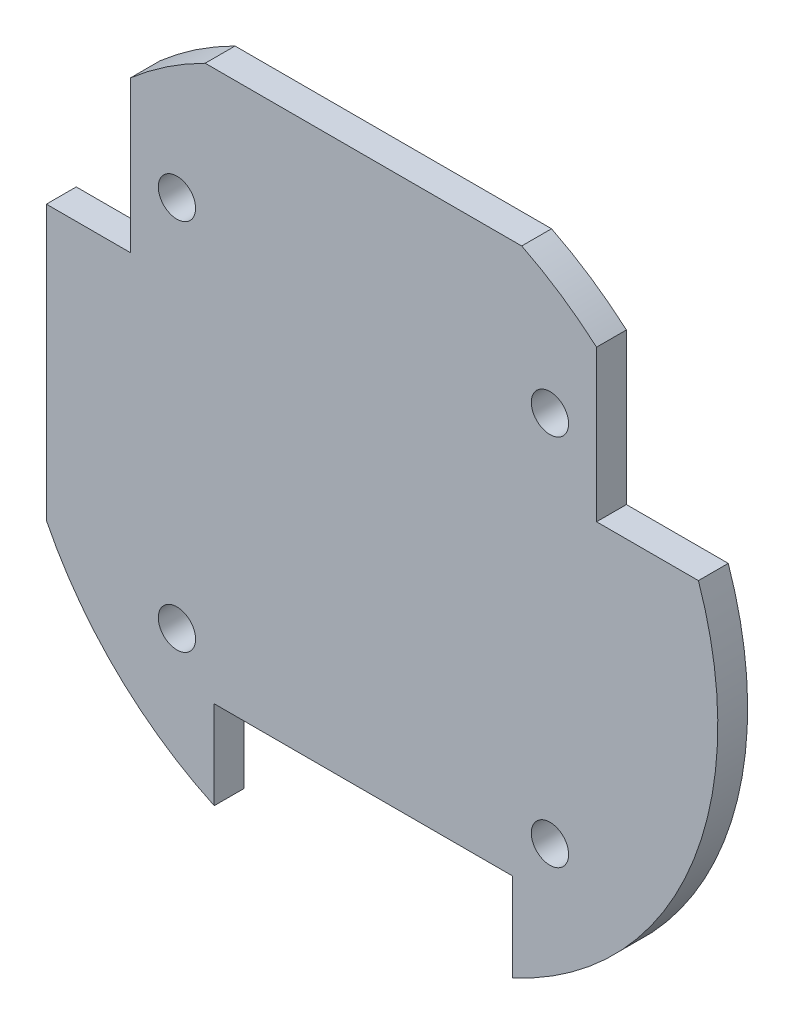
ISO-10303-21;
HEADER;
FILE_DESCRIPTION(('STEP AP214'),'2;1');
FILE_NAME('part.step','',(''),(''),'','','');
FILE_SCHEMA(('AUTOMOTIVE_DESIGN { 1 0 10303 214 1 1 1 1 }'));
ENDSEC;
DATA;
#1=APPLICATION_CONTEXT('core data for automotive mechanical design processes');
#2=APPLICATION_PROTOCOL_DEFINITION('international standard','automotive_design',2000,#1);
#3=PRODUCT_CONTEXT('',#1,'mechanical');
#4=PRODUCT('Part','Part','',(#3));
#5=PRODUCT_RELATED_PRODUCT_CATEGORY('part','',(#4));
#6=PRODUCT_DEFINITION_FORMATION('','',#4);
#7=PRODUCT_DEFINITION_CONTEXT('part definition',#1,'design');
#8=PRODUCT_DEFINITION('design','',#6,#7);
#9=PRODUCT_DEFINITION_SHAPE('','',#8);
#10=(LENGTH_UNIT() NAMED_UNIT(*) SI_UNIT(.MILLI.,.METRE.));
#11=(NAMED_UNIT(*) PLANE_ANGLE_UNIT() SI_UNIT($,.RADIAN.));
#12=(NAMED_UNIT(*) SI_UNIT($,.STERADIAN.) SOLID_ANGLE_UNIT());
#13=UNCERTAINTY_MEASURE_WITH_UNIT(LENGTH_MEASURE(1.E-05),#10,'distance_accuracy_value','');
#14=(GEOMETRIC_REPRESENTATION_CONTEXT(3) GLOBAL_UNCERTAINTY_ASSIGNED_CONTEXT((#13)) GLOBAL_UNIT_ASSIGNED_CONTEXT((#10,
#11,#12)) REPRESENTATION_CONTEXT('',''));
#15=CARTESIAN_POINT('',(0.,0.,0.));
#16=DIRECTION('',(0.,0.,1.));
#17=DIRECTION('',(1.,0.,0.));
#18=AXIS2_PLACEMENT_3D('',#15,#16,#17);
#19=CARTESIAN_POINT('',(0.,-13.25038901263,1.6));
#20=DIRECTION('',(0.,0.,-1.));
#21=DIRECTION('',(-1.,0.,0.));
#22=AXIS2_PLACEMENT_3D('',#19,#20,#21);
#23=CYLINDRICAL_SURFACE('',#22,19.);
#24=CARTESIAN_POINT('',(0.,-13.25038901263,1.6));
#25=DIRECTION('',(0.,0.,1.));
#26=DIRECTION('',(1.,0.,0.));
#27=AXIS2_PLACEMENT_3D('',#24,#25,#26);
#28=CIRCLE('',#27,19.);
#29=CARTESIAN_POINT('',(7.99999999999993,-30.4840769522444,1.59999999999975));
#30=VERTEX_POINT('',#29);
#31=CARTESIAN_POINT('',(17.9599554565149,-7.05038901263001,1.6));
#32=VERTEX_POINT('',#31);
#33=EDGE_CURVE('E200',#30,#32,#28,.T.);
#34=ORIENTED_EDGE('',*,*,#33,.F.);
#35=DIRECTION('',(0.,0.,-1.));
#36=VECTOR('',#35,1.);
#37=CARTESIAN_POINT('',(7.99999999999993,-30.4840769522444,1.59999999999975));
#38=LINE('',#37,#36);
#39=CARTESIAN_POINT('',(7.99999999999993,-30.4840769522442,0.));
#40=VERTEX_POINT('',#39);
#41=EDGE_CURVE('E313',#30,#40,#38,.T.);
#42=ORIENTED_EDGE('',*,*,#41,.T.);
#43=CARTESIAN_POINT('',(0.,-13.25038901263,0.));
#44=DIRECTION('',(0.,0.,1.));
#45=DIRECTION('',(1.,0.,0.));
#46=AXIS2_PLACEMENT_3D('',#43,#44,#45);
#47=CIRCLE('',#46,19.);
#48=CARTESIAN_POINT('',(17.9599554565149,-7.05038901263002,0.));
#49=VERTEX_POINT('',#48);
#50=EDGE_CURVE('E169',#40,#49,#47,.T.);
#51=ORIENTED_EDGE('',*,*,#50,.T.);
#52=DIRECTION('',(0.,0.,-1.));
#53=VECTOR('',#52,1.);
#54=CARTESIAN_POINT('',(17.9599554565149,-7.05038901263001,1.6));
#55=LINE('',#54,#53);
#56=EDGE_CURVE('E47',#32,#49,#55,.T.);
#57=ORIENTED_EDGE('',*,*,#56,.F.);
#58=EDGE_LOOP('',(#34,#42,#51,#57));
#59=FACE_BOUND('',#58,.T.);
#60=ADVANCED_FACE('F44',(#59),#23,.T.);
#61=CARTESIAN_POINT('',(-17.,-21.7356703868686,0.));
#62=VERTEX_POINT('',#61);
#63=CARTESIAN_POINT('',(-8.00000000000007,-30.4840769522441,0.));
#64=VERTEX_POINT('',#63);
#65=EDGE_CURVE('E171',#62,#64,#47,.T.);
#66=ORIENTED_EDGE('',*,*,#65,.T.);
#67=DIRECTION('',(0.,0.,-1.));
#68=VECTOR('',#67,1.);
#69=CARTESIAN_POINT('',(-8.00000000000007,-30.4840769522441,1.59999999999994));
#70=LINE('',#69,#68);
#71=CARTESIAN_POINT('',(-8.00000000000007,-30.4840769522441,1.59999999999994));
#72=VERTEX_POINT('',#71);
#73=EDGE_CURVE('E312',#64,#72,#70,.F.);
#74=ORIENTED_EDGE('',*,*,#73,.T.);
#75=CARTESIAN_POINT('',(-17.,-21.7356703868687,1.59999999999988));
#76=VERTEX_POINT('',#75);
#77=EDGE_CURVE('E182',#76,#72,#28,.T.);
#78=ORIENTED_EDGE('',*,*,#77,.F.);
#79=DIRECTION('',(0.,0.,1.));
#80=VECTOR('',#79,1.);
#81=CARTESIAN_POINT('',(-17.,-21.7356703868686,0.));
#82=LINE('',#81,#80);
#83=EDGE_CURVE('E234',#62,#76,#82,.T.);
#84=ORIENTED_EDGE('',*,*,#83,.F.);
#85=EDGE_LOOP('',(#66,#74,#78,#84));
#86=FACE_BOUND('',#85,.T.);
#87=ADVANCED_FACE('F50',(#86),#23,.T.);
#88=DIRECTION('',(0.,0.,-1.));
#89=VECTOR('',#88,1.);
#90=CARTESIAN_POINT('',(12.4999999999999,1.05869900862419,1.6));
#91=LINE('',#90,#89);
#92=CARTESIAN_POINT('',(12.4999999999999,1.05869900862419,1.6));
#93=VERTEX_POINT('',#92);
#94=CARTESIAN_POINT('',(12.4999999999999,1.05869900862418,0.));
#95=VERTEX_POINT('',#94);
#96=EDGE_CURVE('E227',#93,#95,#91,.T.);
#97=ORIENTED_EDGE('',*,*,#96,.T.);
#98=CARTESIAN_POINT('',(8.48528137423857,3.74961098737,0.));
#99=VERTEX_POINT('',#98);
#100=EDGE_CURVE('E172',#95,#99,#47,.T.);
#101=ORIENTED_EDGE('',*,*,#100,.T.);
#102=DIRECTION('',(0.,0.,1.));
#103=VECTOR('',#102,1.);
#104=CARTESIAN_POINT('',(8.48528137423857,3.74961098737,0.));
#105=LINE('',#104,#103);
#106=CARTESIAN_POINT('',(8.48528137423857,3.74961098737,1.6));
#107=VERTEX_POINT('',#106);
#108=EDGE_CURVE('E243',#99,#107,#105,.T.);
#109=ORIENTED_EDGE('',*,*,#108,.T.);
#110=EDGE_CURVE('E195',#93,#107,#28,.T.);
#111=ORIENTED_EDGE('',*,*,#110,.F.);
#112=EDGE_LOOP('',(#97,#101,#109,#111));
#113=FACE_BOUND('',#112,.T.);
#114=ADVANCED_FACE('F291',(#113),#23,.T.);
#115=CARTESIAN_POINT('',(0.,-13.25038901263,1.6));
#116=DIRECTION('',(0.,0.,1.));
#117=DIRECTION('',(1.,0.,0.));
#118=AXIS2_PLACEMENT_3D('',#115,#116,#117);
#119=PLANE('',#118);
#120=DIRECTION('',(0.,1.,0.));
#121=VECTOR('',#120,1.);
#122=CARTESIAN_POINT('',(7.99999999999993,-36.8182264519574,1.6));
#123=LINE('',#122,#121);
#124=CARTESIAN_POINT('',(7.99999999999985,-25.7503890126301,1.59999999999989));
#125=VERTEX_POINT('',#124);
#126=EDGE_CURVE('E155',#30,#125,#123,.T.);
#127=ORIENTED_EDGE('',*,*,#126,.F.);
#128=ORIENTED_EDGE('',*,*,#33,.T.);
#129=DIRECTION('',(1.,0.,0.));
#130=VECTOR('',#129,1.);
#131=CARTESIAN_POINT('',(12.5,-7.05038901263001,1.6));
#132=LINE('',#131,#130);
#133=CARTESIAN_POINT('',(12.5,-7.05038901263001,1.6));
#134=VERTEX_POINT('',#133);
#135=EDGE_CURVE('E311',#134,#32,#132,.T.);
#136=ORIENTED_EDGE('',*,*,#135,.F.);
#137=DIRECTION('',(0.,-1.,0.));
#138=VECTOR('',#137,1.);
#139=CARTESIAN_POINT('',(12.4999999999999,-5.15038901263001,1.6));
#140=LINE('',#139,#138);
#141=EDGE_CURVE('E318',#93,#134,#140,.T.);
#142=ORIENTED_EDGE('',*,*,#141,.F.);
#143=ORIENTED_EDGE('',*,*,#110,.T.);
#144=DIRECTION('',(1.,0.,0.));
#145=VECTOR('',#144,1.);
#146=CARTESIAN_POINT('',(-8.48528137423857,3.74961098736998,1.6));
#147=LINE('',#146,#145);
#148=CARTESIAN_POINT('',(-8.48528137423857,3.74961098736998,1.6));
#149=VERTEX_POINT('',#148);
#150=EDGE_CURVE('E236',#149,#107,#147,.T.);
#151=ORIENTED_EDGE('',*,*,#150,.F.);
#152=CARTESIAN_POINT('',(-12.5000000000001,1.0586990086242,1.6));
#153=VERTEX_POINT('',#152);
#154=EDGE_CURVE('E188',#149,#153,#28,.T.);
#155=ORIENTED_EDGE('',*,*,#154,.T.);
#156=DIRECTION('',(0.,-1.,0.));
#157=VECTOR('',#156,1.);
#158=CARTESIAN_POINT('',(-12.5000000000001,-5.15038901263002,1.6));
#159=LINE('',#158,#157);
#160=CARTESIAN_POINT('',(-12.5,-7.05038901263002,1.6));
#161=VERTEX_POINT('',#160);
#162=EDGE_CURVE('E230',#153,#161,#159,.T.);
#163=ORIENTED_EDGE('',*,*,#162,.T.);
#164=DIRECTION('',(-1.,0.,0.));
#165=VECTOR('',#164,1.);
#166=CARTESIAN_POINT('',(-12.5,-7.05038901263002,1.6));
#167=LINE('',#166,#165);
#168=CARTESIAN_POINT('',(-17.,-7.05038901263001,1.6));
#169=VERTEX_POINT('',#168);
#170=EDGE_CURVE('E222',#161,#169,#167,.T.);
#171=ORIENTED_EDGE('',*,*,#170,.T.);
#172=DIRECTION('',(0.,1.,0.));
#173=VECTOR('',#172,1.);
#174=CARTESIAN_POINT('',(-17.,-4.76510763839143,1.6));
#175=LINE('',#174,#173);
#176=EDGE_CURVE('E238',#76,#169,#175,.T.);
#177=ORIENTED_EDGE('',*,*,#176,.F.);
#178=ORIENTED_EDGE('',*,*,#77,.T.);
#179=DIRECTION('',(0.,-1.,0.));
#180=VECTOR('',#179,1.);
#181=CARTESIAN_POINT('',(-8.00000000000007,-36.8182264519574,1.6));
#182=LINE('',#181,#180);
#183=CARTESIAN_POINT('',(-8.00000000000015,-25.75038901263,1.59999999999994));
#184=VERTEX_POINT('',#183);
#185=EDGE_CURVE('E165',#184,#72,#182,.T.);
#186=ORIENTED_EDGE('',*,*,#185,.F.);
#187=DIRECTION('',(-1.,0.,0.));
#188=VECTOR('',#187,1.);
#189=CARTESIAN_POINT('',(-8.00000000000015,-25.75038901263,1.59999999999994));
#190=LINE('',#189,#188);
#191=EDGE_CURVE('E466',#125,#184,#190,.T.);
#192=ORIENTED_EDGE('',*,*,#191,.F.);
#193=EDGE_LOOP('',(#127,#128,#136,#142,#143,#151,#155,#163,#171,#177,#178,#186,#192));
#194=FACE_BOUND('',#193,.T.);
#195=CARTESIAN_POINT('',(9.99999999999985,-23.25038901263,1.6));
#196=DIRECTION('',(0.,0.,1.));
#197=DIRECTION('',(1.,0.,0.));
#198=AXIS2_PLACEMENT_3D('',#195,#196,#197);
#199=CIRCLE('',#198,1.00000000000001);
#200=CARTESIAN_POINT('',(10.9999999999999,-23.25038901263,1.6));
#201=VERTEX_POINT('',#200);
#202=EDGE_CURVE('E261',#201,#201,#199,.T.);
#203=ORIENTED_EDGE('',*,*,#202,.F.);
#204=EDGE_LOOP('',(#203));
#205=FACE_BOUND('',#204,.T.);
#206=CARTESIAN_POINT('',(-10.0000000000001,-3.25038901263,1.6));
#207=DIRECTION('',(0.,0.,1.));
#208=DIRECTION('',(1.,0.,0.));
#209=AXIS2_PLACEMENT_3D('',#206,#207,#208);
#210=CIRCLE('',#209,1.00000000000002);
#211=CARTESIAN_POINT('',(-9.00000000000006,-3.25038901263,1.6));
#212=VERTEX_POINT('',#211);
#213=EDGE_CURVE('E177',#212,#212,#210,.T.);
#214=ORIENTED_EDGE('',*,*,#213,.F.);
#215=EDGE_LOOP('',(#214));
#216=FACE_BOUND('',#215,.T.);
#217=CARTESIAN_POINT('',(9.99999999999992,-3.25038901263,1.6));
#218=DIRECTION('',(0.,0.,1.));
#219=DIRECTION('',(1.,0.,0.));
#220=AXIS2_PLACEMENT_3D('',#217,#218,#219);
#221=CIRCLE('',#220,0.999999999999998);
#222=CARTESIAN_POINT('',(10.9999999999999,-3.25038901263,1.6));
#223=VERTEX_POINT('',#222);
#224=EDGE_CURVE('E270',#223,#223,#221,.T.);
#225=ORIENTED_EDGE('',*,*,#224,.F.);
#226=EDGE_LOOP('',(#225));
#227=FACE_BOUND('',#226,.T.);
#228=CARTESIAN_POINT('',(-10.0000000000002,-23.2503890126301,1.59999999999997));
#229=DIRECTION('',(0.,0.,1.));
#230=DIRECTION('',(1.,0.,0.));
#231=AXIS2_PLACEMENT_3D('',#228,#229,#230);
#232=CIRCLE('',#231,1.00000000000001);
#233=CARTESIAN_POINT('',(-9.00000000000015,-23.25038901263,1.59999999999997));
#234=VERTEX_POINT('',#233);
#235=EDGE_CURVE('E251',#234,#234,#232,.T.);
#236=ORIENTED_EDGE('',*,*,#235,.F.);
#237=EDGE_LOOP('',(#236));
#238=FACE_BOUND('',#237,.T.);
#239=ADVANCED_FACE('F305',(#194,#205,#216,#227,#238),#119,.T.);
#240=CARTESIAN_POINT('',(0.,-13.25038901263,0.));
#241=DIRECTION('',(0.,0.,1.));
#242=DIRECTION('',(1.,0.,0.));
#243=AXIS2_PLACEMENT_3D('',#240,#241,#242);
#244=PLANE('',#243);
#245=ORIENTED_EDGE('',*,*,#50,.F.);
#246=DIRECTION('',(0.,1.,0.));
#247=VECTOR('',#246,1.);
#248=CARTESIAN_POINT('',(7.99999999999993,-36.8182264519575,0.));
#249=LINE('',#248,#247);
#250=CARTESIAN_POINT('',(7.99999999999985,-25.75038901263,0.));
#251=VERTEX_POINT('',#250);
#252=EDGE_CURVE('E11',#40,#251,#249,.T.);
#253=ORIENTED_EDGE('',*,*,#252,.T.);
#254=DIRECTION('',(-1.,0.,0.));
#255=VECTOR('',#254,1.);
#256=CARTESIAN_POINT('',(-8.00000000000015,-25.75038901263,0.));
#257=LINE('',#256,#255);
#258=CARTESIAN_POINT('',(-8.00000000000015,-25.75038901263,0.));
#259=VERTEX_POINT('',#258);
#260=EDGE_CURVE('E157',#251,#259,#257,.T.);
#261=ORIENTED_EDGE('',*,*,#260,.T.);
#262=DIRECTION('',(0.,-1.,0.));
#263=VECTOR('',#262,1.);
#264=CARTESIAN_POINT('',(-8.00000000000007,-36.8182264519574,0.));
#265=LINE('',#264,#263);
#266=EDGE_CURVE('E63',#259,#64,#265,.T.);
#267=ORIENTED_EDGE('',*,*,#266,.T.);
#268=ORIENTED_EDGE('',*,*,#65,.F.);
#269=DIRECTION('',(0.,1.,0.));
#270=VECTOR('',#269,1.);
#271=CARTESIAN_POINT('',(-17.,-4.76510763839144,0.));
#272=LINE('',#271,#270);
#273=CARTESIAN_POINT('',(-17.,-7.05038901263002,0.));
#274=VERTEX_POINT('',#273);
#275=EDGE_CURVE('E246',#62,#274,#272,.T.);
#276=ORIENTED_EDGE('',*,*,#275,.T.);
#277=DIRECTION('',(-1.,0.,0.));
#278=VECTOR('',#277,1.);
#279=CARTESIAN_POINT('',(-17.,-7.05038901263002,0.));
#280=LINE('',#279,#278);
#281=CARTESIAN_POINT('',(-12.5,-7.05038901263003,0.));
#282=VERTEX_POINT('',#281);
#283=EDGE_CURVE('E217',#282,#274,#280,.T.);
#284=ORIENTED_EDGE('',*,*,#283,.F.);
#285=DIRECTION('',(0.,-1.,0.));
#286=VECTOR('',#285,1.);
#287=CARTESIAN_POINT('',(-12.5000000000001,-5.15038901263003,0.));
#288=LINE('',#287,#286);
#289=CARTESIAN_POINT('',(-12.5000000000001,1.05869900862419,0.));
#290=VERTEX_POINT('',#289);
#291=EDGE_CURVE('E220',#290,#282,#288,.T.);
#292=ORIENTED_EDGE('',*,*,#291,.F.);
#293=CARTESIAN_POINT('',(-8.48528137423857,3.74961098736999,0.));
#294=VERTEX_POINT('',#293);
#295=EDGE_CURVE('E176',#294,#290,#47,.T.);
#296=ORIENTED_EDGE('',*,*,#295,.F.);
#297=DIRECTION('',(1.,0.,0.));
#298=VECTOR('',#297,1.);
#299=CARTESIAN_POINT('',(-8.48528137423857,3.74961098736999,0.));
#300=LINE('',#299,#298);
#301=EDGE_CURVE('E212',#294,#99,#300,.T.);
#302=ORIENTED_EDGE('',*,*,#301,.T.);
#303=ORIENTED_EDGE('',*,*,#100,.F.);
#304=DIRECTION('',(0.,-1.,0.));
#305=VECTOR('',#304,1.);
#306=CARTESIAN_POINT('',(12.4999999999999,-5.15038901263001,0.));
#307=LINE('',#306,#305);
#308=CARTESIAN_POINT('',(12.5,-7.05038901263001,0.));
#309=VERTEX_POINT('',#308);
#310=EDGE_CURVE('E67',#95,#309,#307,.T.);
#311=ORIENTED_EDGE('',*,*,#310,.T.);
#312=DIRECTION('',(1.,0.,0.));
#313=VECTOR('',#312,1.);
#314=CARTESIAN_POINT('',(17.,-7.05038901263002,0.));
#315=LINE('',#314,#313);
#316=EDGE_CURVE('E166',#309,#49,#315,.T.);
#317=ORIENTED_EDGE('',*,*,#316,.T.);
#318=EDGE_LOOP('',(#245,#253,#261,#267,#268,#276,#284,#292,#296,#302,#303,#311,#317));
#319=FACE_BOUND('',#318,.T.);
#320=CARTESIAN_POINT('',(-10.0000000000002,-23.25038901263,0.));
#321=DIRECTION('',(0.,0.,1.));
#322=DIRECTION('',(1.,0.,0.));
#323=AXIS2_PLACEMENT_3D('',#320,#321,#322);
#324=CIRCLE('',#323,1.00000000000001);
#325=CARTESIAN_POINT('',(-9.00000000000015,-23.25038901263,0.));
#326=VERTEX_POINT('',#325);
#327=EDGE_CURVE('E242',#326,#326,#324,.T.);
#328=ORIENTED_EDGE('',*,*,#327,.T.);
#329=EDGE_LOOP('',(#328));
#330=FACE_BOUND('',#329,.T.);
#331=CARTESIAN_POINT('',(9.99999999999985,-23.25038901263,0.));
#332=DIRECTION('',(0.,0.,1.));
#333=DIRECTION('',(1.,0.,0.));
#334=AXIS2_PLACEMENT_3D('',#331,#332,#333);
#335=CIRCLE('',#334,1.00000000000001);
#336=CARTESIAN_POINT('',(10.9999999999999,-23.25038901263,0.));
#337=VERTEX_POINT('',#336);
#338=EDGE_CURVE('E260',#337,#337,#335,.T.);
#339=ORIENTED_EDGE('',*,*,#338,.T.);
#340=EDGE_LOOP('',(#339));
#341=FACE_BOUND('',#340,.T.);
#342=CARTESIAN_POINT('',(9.99999999999992,-3.25038901263,0.));
#343=DIRECTION('',(0.,0.,1.));
#344=DIRECTION('',(1.,0.,0.));
#345=AXIS2_PLACEMENT_3D('',#342,#343,#344);
#346=CIRCLE('',#345,0.999999999999998);
#347=CARTESIAN_POINT('',(10.9999999999999,-3.25038901263,0.));
#348=VERTEX_POINT('',#347);
#349=EDGE_CURVE('E262',#348,#348,#346,.T.);
#350=ORIENTED_EDGE('',*,*,#349,.T.);
#351=EDGE_LOOP('',(#350));
#352=FACE_BOUND('',#351,.T.);
#353=CARTESIAN_POINT('',(-10.0000000000001,-3.25038901263,0.));
#354=DIRECTION('',(0.,0.,1.));
#355=DIRECTION('',(1.,0.,0.));
#356=AXIS2_PLACEMENT_3D('',#353,#354,#355);
#357=CIRCLE('',#356,1.00000000000002);
#358=CARTESIAN_POINT('',(-9.00000000000006,-3.25038901263,0.));
#359=VERTEX_POINT('',#358);
#360=EDGE_CURVE('E271',#359,#359,#357,.T.);
#361=ORIENTED_EDGE('',*,*,#360,.T.);
#362=EDGE_LOOP('',(#361));
#363=FACE_BOUND('',#362,.T.);
#364=ADVANCED_FACE('F164',(#319,#330,#341,#352,#363),#244,.F.);
#365=ORIENTED_EDGE('',*,*,#295,.T.);
#366=DIRECTION('',(0.,0.,-1.));
#367=VECTOR('',#366,1.);
#368=CARTESIAN_POINT('',(-12.5000000000001,1.0586990086242,1.6));
#369=LINE('',#368,#367);
#370=EDGE_CURVE('E207',#153,#290,#369,.T.);
#371=ORIENTED_EDGE('',*,*,#370,.F.);
#372=ORIENTED_EDGE('',*,*,#154,.F.);
#373=DIRECTION('',(0.,0.,1.));
#374=VECTOR('',#373,1.);
#375=CARTESIAN_POINT('',(-8.48528137423857,3.74961098736999,0.));
#376=LINE('',#375,#374);
#377=EDGE_CURVE('E209',#294,#149,#376,.T.);
#378=ORIENTED_EDGE('',*,*,#377,.F.);
#379=EDGE_LOOP('',(#365,#371,#372,#378));
#380=FACE_BOUND('',#379,.T.);
#381=ADVANCED_FACE('F208',(#380),#23,.T.);
#382=CARTESIAN_POINT('',(-10.0000000000001,-3.25038901263,1.6));
#383=DIRECTION('',(0.,0.,-1.));
#384=DIRECTION('',(-1.,0.,0.));
#385=AXIS2_PLACEMENT_3D('',#382,#383,#384);
#386=CYLINDRICAL_SURFACE('',#385,1.00000000000002);
#387=ORIENTED_EDGE('',*,*,#213,.T.);
#388=EDGE_LOOP('',(#387));
#389=FACE_BOUND('',#388,.T.);
#390=ORIENTED_EDGE('',*,*,#360,.F.);
#391=EDGE_LOOP('',(#390));
#392=FACE_BOUND('',#391,.T.);
#393=ADVANCED_FACE('F283',(#389,#392),#386,.F.);
#394=CARTESIAN_POINT('',(9.99999999999992,-3.25038901263,1.6));
#395=DIRECTION('',(0.,0.,-1.));
#396=DIRECTION('',(-1.,0.,0.));
#397=AXIS2_PLACEMENT_3D('',#394,#395,#396);
#398=CYLINDRICAL_SURFACE('',#397,0.999999999999998);
#399=ORIENTED_EDGE('',*,*,#224,.T.);
#400=EDGE_LOOP('',(#399));
#401=FACE_BOUND('',#400,.T.);
#402=ORIENTED_EDGE('',*,*,#349,.F.);
#403=EDGE_LOOP('',(#402));
#404=FACE_BOUND('',#403,.T.);
#405=ADVANCED_FACE('F281',(#401,#404),#398,.F.);
#406=CARTESIAN_POINT('',(9.99999999999985,-23.25038901263,1.6));
#407=DIRECTION('',(0.,0.,-1.));
#408=DIRECTION('',(-1.,0.,0.));
#409=AXIS2_PLACEMENT_3D('',#406,#407,#408);
#410=CYLINDRICAL_SURFACE('',#409,1.00000000000001);
#411=ORIENTED_EDGE('',*,*,#202,.T.);
#412=EDGE_LOOP('',(#411));
#413=FACE_BOUND('',#412,.T.);
#414=ORIENTED_EDGE('',*,*,#338,.F.);
#415=EDGE_LOOP('',(#414));
#416=FACE_BOUND('',#415,.T.);
#417=ADVANCED_FACE('F289',(#413,#416),#410,.F.);
#418=CARTESIAN_POINT('',(-10.0000000000002,-23.2503890126301,1.59999999999997));
#419=DIRECTION('',(0.,0.,-1.));
#420=DIRECTION('',(-1.,0.,0.));
#421=AXIS2_PLACEMENT_3D('',#418,#419,#420);
#422=CYLINDRICAL_SURFACE('',#421,1.00000000000001);
#423=ORIENTED_EDGE('',*,*,#235,.T.);
#424=EDGE_LOOP('',(#423));
#425=FACE_BOUND('',#424,.T.);
#426=ORIENTED_EDGE('',*,*,#327,.F.);
#427=EDGE_LOOP('',(#426));
#428=FACE_BOUND('',#427,.T.);
#429=ADVANCED_FACE('F342',(#425,#428),#422,.F.);
#430=CARTESIAN_POINT('',(-17.,-4.76510763839144,0.));
#431=DIRECTION('',(1.,0.,0.));
#432=DIRECTION('',(0.,1.,0.));
#433=AXIS2_PLACEMENT_3D('',#430,#431,#432);
#434=PLANE('',#433);
#435=ORIENTED_EDGE('',*,*,#176,.T.);
#436=DIRECTION('',(0.,0.,-1.));
#437=VECTOR('',#436,1.);
#438=CARTESIAN_POINT('',(-17.,-7.05038901263002,0.));
#439=LINE('',#438,#437);
#440=EDGE_CURVE('E181',#169,#274,#439,.T.);
#441=ORIENTED_EDGE('',*,*,#440,.T.);
#442=ORIENTED_EDGE('',*,*,#275,.F.);
#443=ORIENTED_EDGE('',*,*,#83,.T.);
#444=EDGE_LOOP('',(#435,#441,#442,#443));
#445=FACE_BOUND('',#444,.T.);
#446=ADVANCED_FACE('F340',(#445),#434,.F.);
#447=CARTESIAN_POINT('',(-8.48528137423857,3.74961098736999,0.));
#448=DIRECTION('',(0.,-1.,0.));
#449=DIRECTION('',(0.,0.,-1.));
#450=AXIS2_PLACEMENT_3D('',#447,#448,#449);
#451=PLANE('',#450);
#452=ORIENTED_EDGE('',*,*,#150,.T.);
#453=ORIENTED_EDGE('',*,*,#108,.F.);
#454=ORIENTED_EDGE('',*,*,#301,.F.);
#455=ORIENTED_EDGE('',*,*,#377,.T.);
#456=EDGE_LOOP('',(#452,#453,#454,#455));
#457=FACE_BOUND('',#456,.T.);
#458=ADVANCED_FACE('F328',(#457),#451,.F.);
#459=CARTESIAN_POINT('',(-17.,-7.05038901263001,1.6));
#460=DIRECTION('',(0.,-1.,0.));
#461=DIRECTION('',(0.,0.,-1.));
#462=AXIS2_PLACEMENT_3D('',#459,#460,#461);
#463=PLANE('',#462);
#464=ORIENTED_EDGE('',*,*,#170,.F.);
#465=DIRECTION('',(0.,0.,-1.));
#466=VECTOR('',#465,1.);
#467=CARTESIAN_POINT('',(-12.5,-7.05038901263002,1.6));
#468=LINE('',#467,#466);
#469=EDGE_CURVE('E231',#161,#282,#468,.T.);
#470=ORIENTED_EDGE('',*,*,#469,.T.);
#471=ORIENTED_EDGE('',*,*,#283,.T.);
#472=ORIENTED_EDGE('',*,*,#440,.F.);
#473=EDGE_LOOP('',(#464,#470,#471,#472));
#474=FACE_BOUND('',#473,.T.);
#475=ADVANCED_FACE('F330',(#474),#463,.F.);
#476=CARTESIAN_POINT('',(-12.5000000000001,-5.15038901263002,1.6));
#477=DIRECTION('',(1.,0.,0.));
#478=DIRECTION('',(0.,0.,-1.));
#479=AXIS2_PLACEMENT_3D('',#476,#477,#478);
#480=PLANE('',#479);
#481=ORIENTED_EDGE('',*,*,#291,.T.);
#482=ORIENTED_EDGE('',*,*,#469,.F.);
#483=ORIENTED_EDGE('',*,*,#162,.F.);
#484=ORIENTED_EDGE('',*,*,#370,.T.);
#485=EDGE_LOOP('',(#481,#482,#483,#484));
#486=FACE_BOUND('',#485,.T.);
#487=ADVANCED_FACE('F324',(#486),#480,.F.);
#488=CARTESIAN_POINT('',(17.,-7.05038901263001,1.6));
#489=DIRECTION('',(0.,1.,0.));
#490=DIRECTION('',(0.,0.,1.));
#491=AXIS2_PLACEMENT_3D('',#488,#489,#490);
#492=PLANE('',#491);
#493=ORIENTED_EDGE('',*,*,#56,.T.);
#494=ORIENTED_EDGE('',*,*,#316,.F.);
#495=DIRECTION('',(0.,0.,-1.));
#496=VECTOR('',#495,1.);
#497=CARTESIAN_POINT('',(12.5,-7.05038901263001,1.6));
#498=LINE('',#497,#496);
#499=EDGE_CURVE('E310',#134,#309,#498,.T.);
#500=ORIENTED_EDGE('',*,*,#499,.F.);
#501=ORIENTED_EDGE('',*,*,#135,.T.);
#502=EDGE_LOOP('',(#493,#494,#500,#501));
#503=FACE_BOUND('',#502,.T.);
#504=ADVANCED_FACE('F333',(#503),#492,.T.);
#505=CARTESIAN_POINT('',(12.4999999999999,-5.15038901263001,1.6));
#506=DIRECTION('',(1.,0.,0.));
#507=DIRECTION('',(0.,0.,-1.));
#508=AXIS2_PLACEMENT_3D('',#505,#506,#507);
#509=PLANE('',#508);
#510=ORIENTED_EDGE('',*,*,#310,.F.);
#511=ORIENTED_EDGE('',*,*,#96,.F.);
#512=ORIENTED_EDGE('',*,*,#141,.T.);
#513=ORIENTED_EDGE('',*,*,#499,.T.);
#514=EDGE_LOOP('',(#510,#511,#512,#513));
#515=FACE_BOUND('',#514,.T.);
#516=ADVANCED_FACE('F416',(#515),#509,.T.);
#517=CARTESIAN_POINT('',(7.99999999999993,-36.8182264519575,0.));
#518=DIRECTION('',(1.,0.,0.));
#519=DIRECTION('',(0.,0.,-1.));
#520=AXIS2_PLACEMENT_3D('',#517,#518,#519);
#521=PLANE('',#520);
#522=ORIENTED_EDGE('',*,*,#126,.T.);
#523=DIRECTION('',(0.,0.,1.));
#524=VECTOR('',#523,1.);
#525=CARTESIAN_POINT('',(7.99999999999985,-25.75038901263,0.));
#526=LINE('',#525,#524);
#527=EDGE_CURVE('E150',#251,#125,#526,.T.);
#528=ORIENTED_EDGE('',*,*,#527,.F.);
#529=ORIENTED_EDGE('',*,*,#252,.F.);
#530=ORIENTED_EDGE('',*,*,#41,.F.);
#531=EDGE_LOOP('',(#522,#528,#529,#530));
#532=FACE_BOUND('',#531,.T.);
#533=ADVANCED_FACE('F149',(#532),#521,.F.);
#534=CARTESIAN_POINT('',(-8.00000000000007,-36.8182264519574,0.));
#535=DIRECTION('',(-1.,0.,0.));
#536=DIRECTION('',(0.,0.,1.));
#537=AXIS2_PLACEMENT_3D('',#534,#535,#536);
#538=PLANE('',#537);
#539=ORIENTED_EDGE('',*,*,#266,.F.);
#540=DIRECTION('',(0.,0.,1.));
#541=VECTOR('',#540,1.);
#542=CARTESIAN_POINT('',(-8.00000000000015,-25.75038901263,0.));
#543=LINE('',#542,#541);
#544=EDGE_CURVE('E156',#259,#184,#543,.T.);
#545=ORIENTED_EDGE('',*,*,#544,.T.);
#546=ORIENTED_EDGE('',*,*,#185,.T.);
#547=ORIENTED_EDGE('',*,*,#73,.F.);
#548=EDGE_LOOP('',(#539,#545,#546,#547));
#549=FACE_BOUND('',#548,.T.);
#550=ADVANCED_FACE('F443',(#549),#538,.F.);
#551=CARTESIAN_POINT('',(-8.00000000000015,-25.75038901263,0.));
#552=DIRECTION('',(0.,1.,0.));
#553=DIRECTION('',(0.,0.,1.));
#554=AXIS2_PLACEMENT_3D('',#551,#552,#553);
#555=PLANE('',#554);
#556=ORIENTED_EDGE('',*,*,#191,.T.);
#557=ORIENTED_EDGE('',*,*,#544,.F.);
#558=ORIENTED_EDGE('',*,*,#260,.F.);
#559=ORIENTED_EDGE('',*,*,#527,.T.);
#560=EDGE_LOOP('',(#556,#557,#558,#559));
#561=FACE_BOUND('',#560,.T.);
#562=ADVANCED_FACE('F159',(#561),#555,.F.);
#563=CLOSED_SHELL('',(#60,#87,#114,#239,#364,#381,#393,#405,#417,#429,#446,#458,#475,#487,#504,
#516,#533,#550,#562));
#564=MANIFOLD_SOLID_BREP('B2',#563);
#565=ADVANCED_BREP_SHAPE_REPRESENTATION('',(#18,#564),#14);
#566=SHAPE_DEFINITION_REPRESENTATION(#9,#565);
ENDSEC;
END-ISO-10303-21;
